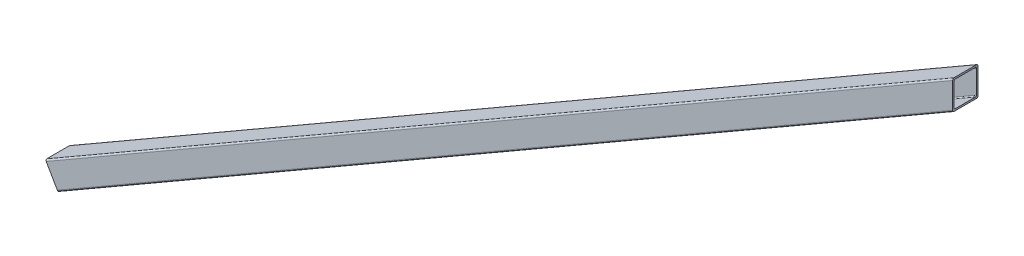
ISO-10303-21;
HEADER;
FILE_DESCRIPTION(('STEP AP214'),'2;1');
FILE_NAME('part.step','',(''),(''),'','','');
FILE_SCHEMA(('AUTOMOTIVE_DESIGN { 1 0 10303 214 1 1 1 1 }'));
ENDSEC;
DATA;
#1=APPLICATION_CONTEXT('core data for automotive mechanical design processes');
#2=APPLICATION_PROTOCOL_DEFINITION('international standard','automotive_design',2000,#1);
#3=PRODUCT_CONTEXT('',#1,'mechanical');
#4=PRODUCT('Part','Part','',(#3));
#5=PRODUCT_RELATED_PRODUCT_CATEGORY('part','',(#4));
#6=PRODUCT_DEFINITION_FORMATION('','',#4);
#7=PRODUCT_DEFINITION_CONTEXT('part definition',#1,'design');
#8=PRODUCT_DEFINITION('design','',#6,#7);
#9=PRODUCT_DEFINITION_SHAPE('','',#8);
#10=(LENGTH_UNIT() NAMED_UNIT(*) SI_UNIT(.MILLI.,.METRE.));
#11=(NAMED_UNIT(*) PLANE_ANGLE_UNIT() SI_UNIT($,.RADIAN.));
#12=(NAMED_UNIT(*) SI_UNIT($,.STERADIAN.) SOLID_ANGLE_UNIT());
#13=UNCERTAINTY_MEASURE_WITH_UNIT(LENGTH_MEASURE(1.E-05),#10,'distance_accuracy_value','');
#14=(GEOMETRIC_REPRESENTATION_CONTEXT(3) GLOBAL_UNCERTAINTY_ASSIGNED_CONTEXT((#13)) GLOBAL_UNIT_ASSIGNED_CONTEXT((#10,
#11,#12)) REPRESENTATION_CONTEXT('',''));
#15=CARTESIAN_POINT('',(0.,0.,0.));
#16=DIRECTION('',(0.,0.,1.));
#17=DIRECTION('',(1.,0.,0.));
#18=AXIS2_PLACEMENT_3D('',#15,#16,#17);
#19=CARTESIAN_POINT('',(-1218.10254037846,1923.73056275187,47.));
#20=DIRECTION('',(0.866025403784438,0.5,0.));
#21=DIRECTION('',(-0.5,0.866025403784439,0.));
#22=AXIS2_PLACEMENT_3D('',#19,#20,#21);
#23=CYLINDRICAL_SURFACE('',#22,3.00000000000002);
#24=DIRECTION('',(0.866025403784438,0.5,0.));
#25=VECTOR('',#24,1.);
#26=CARTESIAN_POINT('',(-1216.60254037846,1921.13248654051,47.));
#27=LINE('',#26,#25);
#28=CARTESIAN_POINT('',(-1216.60254037846,1921.13248654051,47.));
#29=VERTEX_POINT('',#28);
#30=CARTESIAN_POINT('',(550.,2941.0809387791,47.));
#31=VERTEX_POINT('',#30);
#32=EDGE_CURVE('E37',#29,#31,#27,.T.);
#33=ORIENTED_EDGE('',*,*,#32,.T.);
#34=CARTESIAN_POINT('',(550.,2944.54504039423,47.));
#35=DIRECTION('',(1.,0.,0.));
#36=DIRECTION('',(0.,-1.,0.));
#37=AXIS2_PLACEMENT_3D('',#34,#35,#36);
#38=ELLIPSE('',#37,3.46410161513778,3.00000000000002);
#39=CARTESIAN_POINT('',(550.,2944.54504039423,50.));
#40=VERTEX_POINT('',#39);
#41=EDGE_CURVE('E172',#40,#31,#38,.T.);
#42=ORIENTED_EDGE('',*,*,#41,.F.);
#43=DIRECTION('',(0.866025403784438,0.5,0.));
#44=VECTOR('',#43,1.);
#45=CARTESIAN_POINT('',(-1218.10254037846,1923.73056275187,50.));
#46=LINE('',#45,#44);
#47=CARTESIAN_POINT('',(-1218.10254037846,1923.73056275187,50.));
#48=VERTEX_POINT('',#47);
#49=EDGE_CURVE('E11',#48,#40,#46,.T.);
#50=ORIENTED_EDGE('',*,*,#49,.F.);
#51=CARTESIAN_POINT('',(-1218.10254037846,1923.73056275187,47.));
#52=DIRECTION('',(0.866025403784439,0.5,0.));
#53=DIRECTION('',(-0.5,0.866025403784438,0.));
#54=AXIS2_PLACEMENT_3D('',#51,#52,#53);
#55=CIRCLE('',#54,3.00000000000002);
#56=EDGE_CURVE('E234',#48,#29,#55,.T.);
#57=ORIENTED_EDGE('',*,*,#56,.T.);
#58=EDGE_LOOP('',(#33,#42,#50,#57));
#59=FACE_BOUND('',#58,.T.);
#60=ADVANCED_FACE('F34',(#59),#23,.T.);
#61=CARTESIAN_POINT('',(-1240.10254037846,1961.83568051838,50.));
#62=DIRECTION('',(0.,0.,1.));
#63=DIRECTION('',(1.,0.,0.));
#64=AXIS2_PLACEMENT_3D('',#61,#62,#63);
#65=PLANE('',#64);
#66=ORIENTED_EDGE('',*,*,#49,.T.);
#67=DIRECTION('',(0.,-1.,0.));
#68=VECTOR('',#67,1.);
#69=CARTESIAN_POINT('',(550.,3027.09109517469,50.));
#70=LINE('',#69,#68);
#71=CARTESIAN_POINT('',(550.,2995.35186408292,50.));
#72=VERTEX_POINT('',#71);
#73=EDGE_CURVE('E192',#72,#40,#70,.T.);
#74=ORIENTED_EDGE('',*,*,#73,.F.);
#75=DIRECTION('',(0.866025403784438,0.5,0.));
#76=VECTOR('',#75,1.);
#77=CARTESIAN_POINT('',(-1240.10254037846,1961.83568051838,50.));
#78=LINE('',#77,#76);
#79=CARTESIAN_POINT('',(-1240.10254037846,1961.83568051838,50.));
#80=VERTEX_POINT('',#79);
#81=EDGE_CURVE('E42',#80,#72,#78,.T.);
#82=ORIENTED_EDGE('',*,*,#81,.F.);
#83=DIRECTION('',(0.499999999999995,-0.866025403784442,0.));
#84=VECTOR('',#83,1.);
#85=CARTESIAN_POINT('',(-1240.10254037846,1961.83568051838,50.));
#86=LINE('',#85,#84);
#87=EDGE_CURVE('E265',#80,#48,#86,.T.);
#88=ORIENTED_EDGE('',*,*,#87,.T.);
#89=EDGE_LOOP('',(#66,#74,#82,#88));
#90=FACE_BOUND('',#89,.T.);
#91=ADVANCED_FACE('F285',(#90),#65,.T.);
#92=CARTESIAN_POINT('',(-1240.10254037846,1961.83568051838,47.));
#93=DIRECTION('',(0.866025403784438,0.5,0.));
#94=DIRECTION('',(-0.5,0.866025403784439,0.));
#95=AXIS2_PLACEMENT_3D('',#92,#93,#94);
#96=CYLINDRICAL_SURFACE('',#95,2.99999999999992);
#97=ORIENTED_EDGE('',*,*,#81,.T.);
#98=CARTESIAN_POINT('',(550.,2995.35186408292,47.));
#99=DIRECTION('',(1.,0.,0.));
#100=DIRECTION('',(0.,-1.,0.));
#101=AXIS2_PLACEMENT_3D('',#98,#99,#100);
#102=ELLIPSE('',#101,3.46410161513766,2.99999999999992);
#103=CARTESIAN_POINT('',(550.,2998.81596569806,47.));
#104=VERTEX_POINT('',#103);
#105=EDGE_CURVE('E195',#104,#72,#102,.T.);
#106=ORIENTED_EDGE('',*,*,#105,.F.);
#107=DIRECTION('',(0.866025403784438,0.5,0.));
#108=VECTOR('',#107,1.);
#109=CARTESIAN_POINT('',(-1241.60254037846,1964.43375672974,47.));
#110=LINE('',#109,#108);
#111=CARTESIAN_POINT('',(-1241.60254037846,1964.43375672974,47.));
#112=VERTEX_POINT('',#111);
#113=EDGE_CURVE('E269',#112,#104,#110,.T.);
#114=ORIENTED_EDGE('',*,*,#113,.F.);
#115=CARTESIAN_POINT('',(-1240.10254037846,1961.83568051838,47.));
#116=DIRECTION('',(0.866025403784439,0.5,0.));
#117=DIRECTION('',(-0.5,0.866025403784438,0.));
#118=AXIS2_PLACEMENT_3D('',#115,#116,#117);
#119=CIRCLE('',#118,2.99999999999992);
#120=EDGE_CURVE('E262',#112,#80,#119,.T.);
#121=ORIENTED_EDGE('',*,*,#120,.T.);
#122=EDGE_LOOP('',(#97,#106,#114,#121));
#123=FACE_BOUND('',#122,.T.);
#124=ADVANCED_FACE('F306',(#123),#96,.T.);
#125=CARTESIAN_POINT('',(-1241.60254037846,1964.43375672974,47.));
#126=DIRECTION('',(-0.5,0.866025403784438,0.));
#127=DIRECTION('',(-0.866025403784439,-0.5,0.));
#128=AXIS2_PLACEMENT_3D('',#125,#126,#127);
#129=PLANE('',#128);
#130=ORIENTED_EDGE('',*,*,#113,.T.);
#131=DIRECTION('',(0.,0.,1.));
#132=VECTOR('',#131,1.);
#133=CARTESIAN_POINT('',(550.,2998.81596569806,47.));
#134=LINE('',#133,#132);
#135=CARTESIAN_POINT('',(550.,2998.81596569806,2.99999999999999));
#136=VERTEX_POINT('',#135);
#137=EDGE_CURVE('E198',#136,#104,#134,.T.);
#138=ORIENTED_EDGE('',*,*,#137,.F.);
#139=DIRECTION('',(0.866025403784438,0.5,0.));
#140=VECTOR('',#139,1.);
#141=CARTESIAN_POINT('',(-1241.60254037846,1964.43375672974,2.99999999999999));
#142=LINE('',#141,#140);
#143=CARTESIAN_POINT('',(-1241.60254037846,1964.43375672974,2.99999999999999));
#144=VERTEX_POINT('',#143);
#145=EDGE_CURVE('E271',#144,#136,#142,.T.);
#146=ORIENTED_EDGE('',*,*,#145,.F.);
#147=DIRECTION('',(0.,0.,1.));
#148=VECTOR('',#147,1.);
#149=CARTESIAN_POINT('',(-1241.60254037846,1964.43375672974,47.));
#150=LINE('',#149,#148);
#151=EDGE_CURVE('E259',#144,#112,#150,.T.);
#152=ORIENTED_EDGE('',*,*,#151,.T.);
#153=EDGE_LOOP('',(#130,#138,#146,#152));
#154=FACE_BOUND('',#153,.T.);
#155=ADVANCED_FACE('F304',(#154),#129,.T.);
#156=CARTESIAN_POINT('',(-1240.10254037846,1961.83568051838,2.99999999999999));
#157=DIRECTION('',(0.866025403784438,0.5,0.));
#158=DIRECTION('',(-0.5,0.866025403784439,0.));
#159=AXIS2_PLACEMENT_3D('',#156,#157,#158);
#160=CYLINDRICAL_SURFACE('',#159,2.99999999999992);
#161=ORIENTED_EDGE('',*,*,#145,.T.);
#162=CARTESIAN_POINT('',(550.,2995.35186408292,2.99999999999999));
#163=DIRECTION('',(1.,0.,0.));
#164=DIRECTION('',(0.,-1.,0.));
#165=AXIS2_PLACEMENT_3D('',#162,#163,#164);
#166=ELLIPSE('',#165,3.46410161513767,2.99999999999992);
#167=CARTESIAN_POINT('',(550.,2995.35186408292,0.));
#168=VERTEX_POINT('',#167);
#169=EDGE_CURVE('E201',#168,#136,#166,.T.);
#170=ORIENTED_EDGE('',*,*,#169,.F.);
#171=DIRECTION('',(0.866025403784438,0.5,0.));
#172=VECTOR('',#171,1.);
#173=CARTESIAN_POINT('',(-1240.10254037846,1961.83568051838,0.));
#174=LINE('',#173,#172);
#175=CARTESIAN_POINT('',(-1240.10254037846,1961.83568051838,0.));
#176=VERTEX_POINT('',#175);
#177=EDGE_CURVE('E273',#176,#168,#174,.T.);
#178=ORIENTED_EDGE('',*,*,#177,.F.);
#179=CARTESIAN_POINT('',(-1240.10254037846,1961.83568051838,2.99999999999999));
#180=DIRECTION('',(0.866025403784439,0.5,0.));
#181=DIRECTION('',(0.5,-0.866025403784438,0.));
#182=AXIS2_PLACEMENT_3D('',#179,#180,#181);
#183=CIRCLE('',#182,2.99999999999992);
#184=EDGE_CURVE('E256',#176,#144,#183,.T.);
#185=ORIENTED_EDGE('',*,*,#184,.T.);
#186=EDGE_LOOP('',(#161,#170,#178,#185));
#187=FACE_BOUND('',#186,.T.);
#188=ADVANCED_FACE('F301',(#187),#160,.T.);
#189=CARTESIAN_POINT('',(-1240.10254037846,1961.83568051838,0.));
#190=DIRECTION('',(0.,0.,-1.));
#191=DIRECTION('',(-1.,0.,0.));
#192=AXIS2_PLACEMENT_3D('',#189,#190,#191);
#193=PLANE('',#192);
#194=ORIENTED_EDGE('',*,*,#177,.T.);
#195=DIRECTION('',(0.,1.,0.));
#196=VECTOR('',#195,1.);
#197=CARTESIAN_POINT('',(550.,3027.09109517469,0.));
#198=LINE('',#197,#196);
#199=CARTESIAN_POINT('',(550.,2944.54504039423,0.));
#200=VERTEX_POINT('',#199);
#201=EDGE_CURVE('E204',#200,#168,#198,.T.);
#202=ORIENTED_EDGE('',*,*,#201,.F.);
#203=DIRECTION('',(0.866025403784438,0.5,0.));
#204=VECTOR('',#203,1.);
#205=CARTESIAN_POINT('',(-1218.10254037846,1923.73056275187,0.));
#206=LINE('',#205,#204);
#207=CARTESIAN_POINT('',(-1218.10254037846,1923.73056275187,0.));
#208=VERTEX_POINT('',#207);
#209=EDGE_CURVE('E275',#208,#200,#206,.T.);
#210=ORIENTED_EDGE('',*,*,#209,.F.);
#211=DIRECTION('',(-0.499999999999995,0.866025403784442,0.));
#212=VECTOR('',#211,1.);
#213=CARTESIAN_POINT('',(-1240.10254037846,1961.83568051838,0.));
#214=LINE('',#213,#212);
#215=EDGE_CURVE('E253',#208,#176,#214,.T.);
#216=ORIENTED_EDGE('',*,*,#215,.T.);
#217=EDGE_LOOP('',(#194,#202,#210,#216));
#218=FACE_BOUND('',#217,.T.);
#219=ADVANCED_FACE('F299',(#218),#193,.T.);
#220=CARTESIAN_POINT('',(-1218.10254037846,1923.73056275187,2.99999999999999));
#221=DIRECTION('',(0.866025403784438,0.5,0.));
#222=DIRECTION('',(-0.5,0.866025403784439,0.));
#223=AXIS2_PLACEMENT_3D('',#220,#221,#222);
#224=CYLINDRICAL_SURFACE('',#223,3.00000000000002);
#225=ORIENTED_EDGE('',*,*,#209,.T.);
#226=CARTESIAN_POINT('',(550.,2944.54504039423,2.99999999999999));
#227=DIRECTION('',(1.,0.,0.));
#228=DIRECTION('',(0.,-1.,0.));
#229=AXIS2_PLACEMENT_3D('',#226,#227,#228);
#230=ELLIPSE('',#229,3.46410161513778,3.00000000000002);
#231=CARTESIAN_POINT('',(550.,2941.0809387791,2.99999999999998));
#232=VERTEX_POINT('',#231);
#233=EDGE_CURVE('E207',#232,#200,#230,.T.);
#234=ORIENTED_EDGE('',*,*,#233,.F.);
#235=DIRECTION('',(0.866025403784438,0.5,0.));
#236=VECTOR('',#235,1.);
#237=CARTESIAN_POINT('',(-1216.60254037846,1921.13248654051,2.99999999999998));
#238=LINE('',#237,#236);
#239=CARTESIAN_POINT('',(-1216.60254037846,1921.13248654051,2.99999999999998));
#240=VERTEX_POINT('',#239);
#241=EDGE_CURVE('E276',#240,#232,#238,.T.);
#242=ORIENTED_EDGE('',*,*,#241,.F.);
#243=CARTESIAN_POINT('',(-1218.10254037846,1923.73056275187,2.99999999999999));
#244=DIRECTION('',(0.866025403784439,0.5,0.));
#245=DIRECTION('',(-0.5,0.866025403784438,0.));
#246=AXIS2_PLACEMENT_3D('',#243,#244,#245);
#247=CIRCLE('',#246,3.00000000000002);
#248=EDGE_CURVE('E250',#240,#208,#247,.T.);
#249=ORIENTED_EDGE('',*,*,#248,.T.);
#250=EDGE_LOOP('',(#225,#234,#242,#249));
#251=FACE_BOUND('',#250,.T.);
#252=ADVANCED_FACE('F295',(#251),#224,.T.);
#253=CARTESIAN_POINT('',(-1216.60254037846,1921.13248654051,47.));
#254=DIRECTION('',(0.5,-0.866025403784438,0.));
#255=DIRECTION('',(0.866025403784439,0.5,0.));
#256=AXIS2_PLACEMENT_3D('',#253,#254,#255);
#257=PLANE('',#256);
#258=ORIENTED_EDGE('',*,*,#241,.T.);
#259=DIRECTION('',(0.,0.,-1.));
#260=VECTOR('',#259,1.);
#261=CARTESIAN_POINT('',(550.,2941.0809387791,47.));
#262=LINE('',#261,#260);
#263=EDGE_CURVE('E210',#31,#232,#262,.T.);
#264=ORIENTED_EDGE('',*,*,#263,.F.);
#265=ORIENTED_EDGE('',*,*,#32,.F.);
#266=DIRECTION('',(0.,0.,-1.));
#267=VECTOR('',#266,1.);
#268=CARTESIAN_POINT('',(-1216.60254037846,1921.13248654051,47.));
#269=LINE('',#268,#267);
#270=EDGE_CURVE('E247',#29,#240,#269,.T.);
#271=ORIENTED_EDGE('',*,*,#270,.T.);
#272=EDGE_LOOP('',(#258,#264,#265,#271));
#273=FACE_BOUND('',#272,.T.);
#274=ADVANCED_FACE('F281',(#273),#257,.T.);
#275=CARTESIAN_POINT('',(-1218.10254037846,1923.73056275187,47.));
#276=DIRECTION('',(0.866025403784439,0.5,0.));
#277=DIRECTION('',(-0.5,0.866025403784438,0.));
#278=AXIS2_PLACEMENT_3D('',#275,#276,#277);
#279=PLANE('',#278);
#280=DIRECTION('',(0.499999999999999,-0.866025403784439,0.));
#281=VECTOR('',#280,1.);
#282=CARTESIAN_POINT('',(-1239.10254037846,1960.10362971082,47.));
#283=LINE('',#282,#281);
#284=CARTESIAN_POINT('',(-1239.10254037846,1960.10362971082,47.));
#285=VERTEX_POINT('',#284);
#286=CARTESIAN_POINT('',(-1219.10254037846,1925.46261355944,47.));
#287=VERTEX_POINT('',#286);
#288=EDGE_CURVE('E152',#285,#287,#283,.T.);
#289=ORIENTED_EDGE('',*,*,#288,.T.);
#290=CARTESIAN_POINT('',(-1219.10254037846,1925.46261355944,45.));
#291=DIRECTION('',(0.866025403784439,0.5,0.));
#292=DIRECTION('',(-0.5,0.866025403784438,0.));
#293=AXIS2_PLACEMENT_3D('',#290,#291,#292);
#294=CIRCLE('',#293,1.99999999999998);
#295=CARTESIAN_POINT('',(-1218.10254037846,1923.73056275187,45.));
#296=VERTEX_POINT('',#295);
#297=EDGE_CURVE('E171',#287,#296,#294,.T.);
#298=ORIENTED_EDGE('',*,*,#297,.T.);
#299=DIRECTION('',(0.,0.,-1.));
#300=VECTOR('',#299,1.);
#301=CARTESIAN_POINT('',(-1218.10254037846,1923.73056275187,45.));
#302=LINE('',#301,#300);
#303=CARTESIAN_POINT('',(-1218.10254037846,1923.73056275187,4.99999999999999));
#304=VERTEX_POINT('',#303);
#305=EDGE_CURVE('E217',#296,#304,#302,.T.);
#306=ORIENTED_EDGE('',*,*,#305,.T.);
#307=CARTESIAN_POINT('',(-1219.10254037846,1925.46261355944,4.99999999999999));
#308=DIRECTION('',(0.866025403784439,0.5,0.));
#309=DIRECTION('',(-0.5,0.866025403784438,0.));
#310=AXIS2_PLACEMENT_3D('',#307,#308,#309);
#311=CIRCLE('',#310,1.99999999999998);
#312=CARTESIAN_POINT('',(-1219.10254037846,1925.46261355944,2.99999999999999));
#313=VERTEX_POINT('',#312);
#314=EDGE_CURVE('E50',#304,#313,#311,.T.);
#315=ORIENTED_EDGE('',*,*,#314,.T.);
#316=DIRECTION('',(-0.499999999999999,0.866025403784439,0.));
#317=VECTOR('',#316,1.);
#318=CARTESIAN_POINT('',(-1239.10254037846,1960.10362971082,2.99999999999999));
#319=LINE('',#318,#317);
#320=CARTESIAN_POINT('',(-1239.10254037846,1960.10362971082,3.00000000000001));
#321=VERTEX_POINT('',#320);
#322=EDGE_CURVE('E221',#313,#321,#319,.T.);
#323=ORIENTED_EDGE('',*,*,#322,.T.);
#324=CARTESIAN_POINT('',(-1239.10254037846,1960.10362971082,4.99999999999999));
#325=DIRECTION('',(0.866025403784439,0.5,0.));
#326=DIRECTION('',(0.5,-0.866025403784438,0.));
#327=AXIS2_PLACEMENT_3D('',#324,#325,#326);
#328=CIRCLE('',#327,1.99999999999998);
#329=CARTESIAN_POINT('',(-1240.10254037846,1961.83568051838,4.99999999999999));
#330=VERTEX_POINT('',#329);
#331=EDGE_CURVE('E224',#321,#330,#328,.T.);
#332=ORIENTED_EDGE('',*,*,#331,.T.);
#333=DIRECTION('',(0.,0.,1.));
#334=VECTOR('',#333,1.);
#335=CARTESIAN_POINT('',(-1240.10254037846,1961.83568051838,45.));
#336=LINE('',#335,#334);
#337=CARTESIAN_POINT('',(-1240.10254037846,1961.83568051838,45.));
#338=VERTEX_POINT('',#337);
#339=EDGE_CURVE('E227',#330,#338,#336,.T.);
#340=ORIENTED_EDGE('',*,*,#339,.T.);
#341=CARTESIAN_POINT('',(-1239.10254037846,1960.10362971082,45.));
#342=DIRECTION('',(0.866025403784439,0.5,0.));
#343=DIRECTION('',(-0.5,0.866025403784438,0.));
#344=AXIS2_PLACEMENT_3D('',#341,#342,#343);
#345=CIRCLE('',#344,1.99999999999998);
#346=EDGE_CURVE('E230',#338,#285,#345,.T.);
#347=ORIENTED_EDGE('',*,*,#346,.T.);
#348=EDGE_LOOP('',(#289,#298,#306,#315,#323,#332,#340,#347));
#349=FACE_BOUND('',#348,.T.);
#350=ORIENTED_EDGE('',*,*,#56,.F.);
#351=ORIENTED_EDGE('',*,*,#87,.F.);
#352=ORIENTED_EDGE('',*,*,#120,.F.);
#353=ORIENTED_EDGE('',*,*,#151,.F.);
#354=ORIENTED_EDGE('',*,*,#184,.F.);
#355=ORIENTED_EDGE('',*,*,#215,.F.);
#356=ORIENTED_EDGE('',*,*,#248,.F.);
#357=ORIENTED_EDGE('',*,*,#270,.F.);
#358=EDGE_LOOP('',(#350,#351,#352,#353,#354,#355,#356,#357));
#359=FACE_BOUND('',#358,.T.);
#360=ADVANCED_FACE('F289',(#349,#359),#279,.F.);
#361=CARTESIAN_POINT('',(-1219.10254037846,1925.46261355944,45.));
#362=DIRECTION('',(0.866025403784438,0.5,0.));
#363=DIRECTION('',(-0.5,0.866025403784439,0.));
#364=AXIS2_PLACEMENT_3D('',#361,#362,#363);
#365=CYLINDRICAL_SURFACE('',#364,1.99999999999998);
#366=DIRECTION('',(0.866025403784438,0.5,0.));
#367=VECTOR('',#366,1.);
#368=CARTESIAN_POINT('',(-1219.10254037846,1925.46261355944,47.));
#369=LINE('',#368,#367);
#370=CARTESIAN_POINT('',(550.,2946.85444147099,47.));
#371=VERTEX_POINT('',#370);
#372=EDGE_CURVE('E157',#287,#371,#369,.T.);
#373=ORIENTED_EDGE('',*,*,#372,.T.);
#374=CARTESIAN_POINT('',(550.,2946.85444147099,45.));
#375=DIRECTION('',(1.,0.,0.));
#376=DIRECTION('',(0.,-1.,0.));
#377=AXIS2_PLACEMENT_3D('',#374,#375,#376);
#378=ELLIPSE('',#377,2.30940107675848,1.99999999999998);
#379=CARTESIAN_POINT('',(550.,2944.54504039423,45.));
#380=VERTEX_POINT('',#379);
#381=EDGE_CURVE('E170',#371,#380,#378,.T.);
#382=ORIENTED_EDGE('',*,*,#381,.T.);
#383=DIRECTION('',(0.866025403784438,0.5,0.));
#384=VECTOR('',#383,1.);
#385=CARTESIAN_POINT('',(-1218.10254037846,1923.73056275187,45.));
#386=LINE('',#385,#384);
#387=EDGE_CURVE('E233',#296,#380,#386,.T.);
#388=ORIENTED_EDGE('',*,*,#387,.F.);
#389=ORIENTED_EDGE('',*,*,#297,.F.);
#390=EDGE_LOOP('',(#373,#382,#388,#389));
#391=FACE_BOUND('',#390,.T.);
#392=ADVANCED_FACE('F372',(#391),#365,.F.);
#393=CARTESIAN_POINT('',(-1239.10254037846,1960.10362971082,47.));
#394=DIRECTION('',(0.,0.,1.));
#395=DIRECTION('',(1.,0.,0.));
#396=AXIS2_PLACEMENT_3D('',#393,#394,#395);
#397=PLANE('',#396);
#398=DIRECTION('',(0.866025403784438,0.5,0.));
#399=VECTOR('',#398,1.);
#400=CARTESIAN_POINT('',(-1239.10254037846,1960.10362971082,47.));
#401=LINE('',#400,#399);
#402=CARTESIAN_POINT('',(550.,2993.04246300616,47.));
#403=VERTEX_POINT('',#402);
#404=EDGE_CURVE('E147',#285,#403,#401,.T.);
#405=ORIENTED_EDGE('',*,*,#404,.T.);
#406=DIRECTION('',(0.,-1.,0.));
#407=VECTOR('',#406,1.);
#408=CARTESIAN_POINT('',(550.,3025.35904436712,47.));
#409=LINE('',#408,#407);
#410=EDGE_CURVE('E150',#403,#371,#409,.T.);
#411=ORIENTED_EDGE('',*,*,#410,.T.);
#412=ORIENTED_EDGE('',*,*,#372,.F.);
#413=ORIENTED_EDGE('',*,*,#288,.F.);
#414=EDGE_LOOP('',(#405,#411,#412,#413));
#415=FACE_BOUND('',#414,.T.);
#416=ADVANCED_FACE('F149',(#415),#397,.F.);
#417=CARTESIAN_POINT('',(-1239.10254037846,1960.10362971082,45.));
#418=DIRECTION('',(0.866025403784438,0.5,0.));
#419=DIRECTION('',(-0.5,0.866025403784439,0.));
#420=AXIS2_PLACEMENT_3D('',#417,#418,#419);
#421=CYLINDRICAL_SURFACE('',#420,1.99999999999998);
#422=DIRECTION('',(0.866025403784438,0.5,0.));
#423=VECTOR('',#422,1.);
#424=CARTESIAN_POINT('',(-1240.10254037846,1961.83568051838,45.));
#425=LINE('',#424,#423);
#426=CARTESIAN_POINT('',(550.,2995.35186408292,45.));
#427=VERTEX_POINT('',#426);
#428=EDGE_CURVE('E158',#338,#427,#425,.T.);
#429=ORIENTED_EDGE('',*,*,#428,.T.);
#430=CARTESIAN_POINT('',(550.,2993.04246300616,45.));
#431=DIRECTION('',(1.,0.,0.));
#432=DIRECTION('',(0.,-1.,0.));
#433=AXIS2_PLACEMENT_3D('',#430,#431,#432);
#434=ELLIPSE('',#433,2.30940107675848,1.99999999999998);
#435=EDGE_CURVE('E166',#427,#403,#434,.T.);
#436=ORIENTED_EDGE('',*,*,#435,.T.);
#437=ORIENTED_EDGE('',*,*,#404,.F.);
#438=ORIENTED_EDGE('',*,*,#346,.F.);
#439=EDGE_LOOP('',(#429,#436,#437,#438));
#440=FACE_BOUND('',#439,.T.);
#441=ADVANCED_FACE('F174',(#440),#421,.F.);
#442=CARTESIAN_POINT('',(-1240.10254037846,1961.83568051838,45.));
#443=DIRECTION('',(-0.5,0.866025403784438,0.));
#444=DIRECTION('',(-0.866025403784439,-0.5,0.));
#445=AXIS2_PLACEMENT_3D('',#442,#443,#444);
#446=PLANE('',#445);
#447=DIRECTION('',(0.866025403784438,0.5,0.));
#448=VECTOR('',#447,1.);
#449=CARTESIAN_POINT('',(-1240.10254037846,1961.83568051838,4.99999999999999));
#450=LINE('',#449,#448);
#451=CARTESIAN_POINT('',(550.,2995.35186408292,4.99999999999999));
#452=VERTEX_POINT('',#451);
#453=EDGE_CURVE('E237',#330,#452,#450,.T.);
#454=ORIENTED_EDGE('',*,*,#453,.T.);
#455=DIRECTION('',(0.,0.,1.));
#456=VECTOR('',#455,1.);
#457=CARTESIAN_POINT('',(550.,2995.35186408292,45.));
#458=LINE('',#457,#456);
#459=EDGE_CURVE('E175',#452,#427,#458,.T.);
#460=ORIENTED_EDGE('',*,*,#459,.T.);
#461=ORIENTED_EDGE('',*,*,#428,.F.);
#462=ORIENTED_EDGE('',*,*,#339,.F.);
#463=EDGE_LOOP('',(#454,#460,#461,#462));
#464=FACE_BOUND('',#463,.T.);
#465=ADVANCED_FACE('F399',(#464),#446,.F.);
#466=CARTESIAN_POINT('',(-1239.10254037846,1960.10362971082,4.99999999999999));
#467=DIRECTION('',(0.866025403784438,0.5,0.));
#468=DIRECTION('',(-0.5,0.866025403784439,0.));
#469=AXIS2_PLACEMENT_3D('',#466,#467,#468);
#470=CYLINDRICAL_SURFACE('',#469,1.99999999999998);
#471=DIRECTION('',(0.866025403784438,0.5,0.));
#472=VECTOR('',#471,1.);
#473=CARTESIAN_POINT('',(-1239.10254037846,1960.10362971082,3.00000000000001));
#474=LINE('',#473,#472);
#475=CARTESIAN_POINT('',(550.,2993.04246300616,3.00000000000001));
#476=VERTEX_POINT('',#475);
#477=EDGE_CURVE('E239',#321,#476,#474,.T.);
#478=ORIENTED_EDGE('',*,*,#477,.T.);
#479=CARTESIAN_POINT('',(550.,2993.04246300616,4.99999999999999));
#480=DIRECTION('',(1.,0.,0.));
#481=DIRECTION('',(0.,-1.,0.));
#482=AXIS2_PLACEMENT_3D('',#479,#480,#481);
#483=ELLIPSE('',#482,2.30940107675848,1.99999999999998);
#484=EDGE_CURVE('E177',#476,#452,#483,.T.);
#485=ORIENTED_EDGE('',*,*,#484,.T.);
#486=ORIENTED_EDGE('',*,*,#453,.F.);
#487=ORIENTED_EDGE('',*,*,#331,.F.);
#488=EDGE_LOOP('',(#478,#485,#486,#487));
#489=FACE_BOUND('',#488,.T.);
#490=ADVANCED_FACE('F408',(#489),#470,.F.);
#491=CARTESIAN_POINT('',(-1239.10254037846,1960.10362971082,2.99999999999999));
#492=DIRECTION('',(0.,0.,-1.));
#493=DIRECTION('',(-1.,0.,0.));
#494=AXIS2_PLACEMENT_3D('',#491,#492,#493);
#495=PLANE('',#494);
#496=DIRECTION('',(0.866025403784438,0.5,0.));
#497=VECTOR('',#496,1.);
#498=CARTESIAN_POINT('',(-1219.10254037846,1925.46261355944,2.99999999999999));
#499=LINE('',#498,#497);
#500=CARTESIAN_POINT('',(550.,2946.85444147099,2.99999999999999));
#501=VERTEX_POINT('',#500);
#502=EDGE_CURVE('E241',#313,#501,#499,.T.);
#503=ORIENTED_EDGE('',*,*,#502,.T.);
#504=DIRECTION('',(0.,1.,0.));
#505=VECTOR('',#504,1.);
#506=CARTESIAN_POINT('',(550.,3025.35904436712,2.99999999999999));
#507=LINE('',#506,#505);
#508=EDGE_CURVE('E182',#501,#476,#507,.T.);
#509=ORIENTED_EDGE('',*,*,#508,.T.);
#510=ORIENTED_EDGE('',*,*,#477,.F.);
#511=ORIENTED_EDGE('',*,*,#322,.F.);
#512=EDGE_LOOP('',(#503,#509,#510,#511));
#513=FACE_BOUND('',#512,.T.);
#514=ADVANCED_FACE('F418',(#513),#495,.F.);
#515=CARTESIAN_POINT('',(-1219.10254037846,1925.46261355944,4.99999999999999));
#516=DIRECTION('',(0.866025403784438,0.5,0.));
#517=DIRECTION('',(-0.5,0.866025403784439,0.));
#518=AXIS2_PLACEMENT_3D('',#515,#516,#517);
#519=CYLINDRICAL_SURFACE('',#518,1.99999999999998);
#520=DIRECTION('',(0.866025403784438,0.5,0.));
#521=VECTOR('',#520,1.);
#522=CARTESIAN_POINT('',(-1218.10254037846,1923.73056275187,4.99999999999999));
#523=LINE('',#522,#521);
#524=CARTESIAN_POINT('',(550.,2944.54504039423,4.99999999999999));
#525=VERTEX_POINT('',#524);
#526=EDGE_CURVE('E243',#304,#525,#523,.T.);
#527=ORIENTED_EDGE('',*,*,#526,.T.);
#528=CARTESIAN_POINT('',(550.,2946.85444147099,4.99999999999999));
#529=DIRECTION('',(1.,0.,0.));
#530=DIRECTION('',(0.,-1.,0.));
#531=AXIS2_PLACEMENT_3D('',#528,#529,#530);
#532=ELLIPSE('',#531,2.30940107675848,1.99999999999998);
#533=EDGE_CURVE('E185',#525,#501,#532,.T.);
#534=ORIENTED_EDGE('',*,*,#533,.T.);
#535=ORIENTED_EDGE('',*,*,#502,.F.);
#536=ORIENTED_EDGE('',*,*,#314,.F.);
#537=EDGE_LOOP('',(#527,#534,#535,#536));
#538=FACE_BOUND('',#537,.T.);
#539=ADVANCED_FACE('F428',(#538),#519,.F.);
#540=CARTESIAN_POINT('',(-1218.10254037846,1923.73056275187,45.));
#541=DIRECTION('',(0.5,-0.866025403784438,0.));
#542=DIRECTION('',(0.866025403784439,0.5,0.));
#543=AXIS2_PLACEMENT_3D('',#540,#541,#542);
#544=PLANE('',#543);
#545=ORIENTED_EDGE('',*,*,#387,.T.);
#546=DIRECTION('',(0.,0.,-1.));
#547=VECTOR('',#546,1.);
#548=CARTESIAN_POINT('',(550.,2944.54504039423,45.));
#549=LINE('',#548,#547);
#550=EDGE_CURVE('E188',#380,#525,#549,.T.);
#551=ORIENTED_EDGE('',*,*,#550,.T.);
#552=ORIENTED_EDGE('',*,*,#526,.F.);
#553=ORIENTED_EDGE('',*,*,#305,.F.);
#554=EDGE_LOOP('',(#545,#551,#552,#553));
#555=FACE_BOUND('',#554,.T.);
#556=ADVANCED_FACE('F438',(#555),#544,.F.);
#557=CARTESIAN_POINT('',(550.,0.,0.));
#558=DIRECTION('',(1.,0.,0.));
#559=DIRECTION('',(0.,0.,-1.));
#560=AXIS2_PLACEMENT_3D('',#557,#558,#559);
#561=PLANE('',#560);
#562=ORIENTED_EDGE('',*,*,#381,.F.);
#563=ORIENTED_EDGE('',*,*,#410,.F.);
#564=ORIENTED_EDGE('',*,*,#435,.F.);
#565=ORIENTED_EDGE('',*,*,#459,.F.);
#566=ORIENTED_EDGE('',*,*,#484,.F.);
#567=ORIENTED_EDGE('',*,*,#508,.F.);
#568=ORIENTED_EDGE('',*,*,#533,.F.);
#569=ORIENTED_EDGE('',*,*,#550,.F.);
#570=EDGE_LOOP('',(#562,#563,#564,#565,#566,#567,#568,#569));
#571=FACE_BOUND('',#570,.T.);
#572=ORIENTED_EDGE('',*,*,#73,.T.);
#573=ORIENTED_EDGE('',*,*,#41,.T.);
#574=ORIENTED_EDGE('',*,*,#263,.T.);
#575=ORIENTED_EDGE('',*,*,#233,.T.);
#576=ORIENTED_EDGE('',*,*,#201,.T.);
#577=ORIENTED_EDGE('',*,*,#169,.T.);
#578=ORIENTED_EDGE('',*,*,#137,.T.);
#579=ORIENTED_EDGE('',*,*,#105,.T.);
#580=EDGE_LOOP('',(#572,#573,#574,#575,#576,#577,#578,#579));
#581=FACE_BOUND('',#580,.T.);
#582=ADVANCED_FACE('F163',(#571,#581),#561,.T.);
#583=CLOSED_SHELL('',(#60,#91,#124,#155,#188,#219,#252,#274,#360,#392,#416,#441,#465,#490,#514,
#539,#556,#582));
#584=MANIFOLD_SOLID_BREP('B2',#583);
#585=ADVANCED_BREP_SHAPE_REPRESENTATION('',(#18,#584),#14);
#586=SHAPE_DEFINITION_REPRESENTATION(#9,#585);
ENDSEC;
END-ISO-10303-21;
